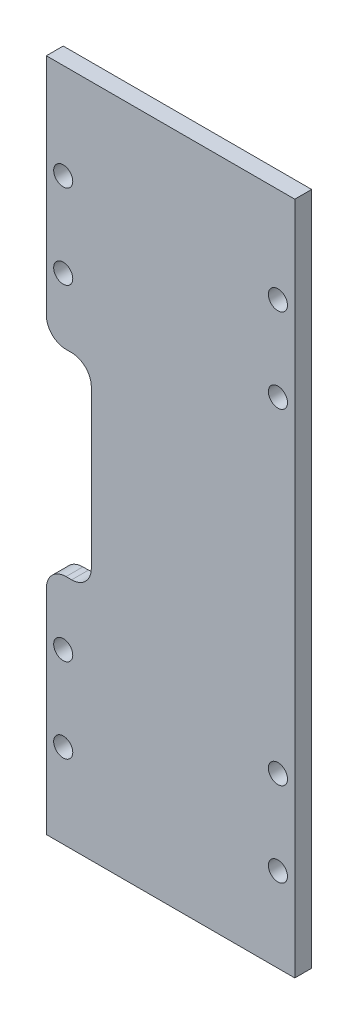
ISO-10303-21;
HEADER;
FILE_DESCRIPTION(('STEP AP214'),'2;1');
FILE_NAME('part.step','',(''),(''),'','','');
FILE_SCHEMA(('AUTOMOTIVE_DESIGN { 1 0 10303 214 1 1 1 1 }'));
ENDSEC;
DATA;
#1=APPLICATION_CONTEXT('core data for automotive mechanical design processes');
#2=APPLICATION_PROTOCOL_DEFINITION('international standard','automotive_design',2000,#1);
#3=PRODUCT_CONTEXT('',#1,'mechanical');
#4=PRODUCT('Part','Part','',(#3));
#5=PRODUCT_RELATED_PRODUCT_CATEGORY('part','',(#4));
#6=PRODUCT_DEFINITION_FORMATION('','',#4);
#7=PRODUCT_DEFINITION_CONTEXT('part definition',#1,'design');
#8=PRODUCT_DEFINITION('design','',#6,#7);
#9=PRODUCT_DEFINITION_SHAPE('','',#8);
#10=(LENGTH_UNIT() NAMED_UNIT(*) SI_UNIT(.MILLI.,.METRE.));
#11=(NAMED_UNIT(*) PLANE_ANGLE_UNIT() SI_UNIT($,.RADIAN.));
#12=(NAMED_UNIT(*) SI_UNIT($,.STERADIAN.) SOLID_ANGLE_UNIT());
#13=UNCERTAINTY_MEASURE_WITH_UNIT(LENGTH_MEASURE(1.E-05),#10,'distance_accuracy_value','');
#14=(GEOMETRIC_REPRESENTATION_CONTEXT(3) GLOBAL_UNCERTAINTY_ASSIGNED_CONTEXT((#13)) GLOBAL_UNIT_ASSIGNED_CONTEXT((#10,
#11,#12)) REPRESENTATION_CONTEXT('',''));
#15=CARTESIAN_POINT('',(0.,0.,0.));
#16=DIRECTION('',(0.,0.,1.));
#17=DIRECTION('',(1.,0.,0.));
#18=AXIS2_PLACEMENT_3D('',#15,#16,#17);
#19=CARTESIAN_POINT('',(-21.7876310709739,70.4697823685379,3.));
#20=DIRECTION('',(1.,0.,0.));
#21=DIRECTION('',(0.,0.,-1.));
#22=AXIS2_PLACEMENT_3D('',#19,#20,#21);
#23=PLANE('',#22);
#24=DIRECTION('',(0.,-1.,0.));
#25=VECTOR('',#24,1.);
#26=CARTESIAN_POINT('',(-21.7876310709739,70.4697823685379,0.));
#27=LINE('',#26,#25);
#28=CARTESIAN_POINT('',(-21.7876310709739,70.4697823685379,0.));
#29=VERTEX_POINT('',#28);
#30=CARTESIAN_POINT('',(-21.7876310709739,30.4697823685379,0.));
#31=VERTEX_POINT('',#30);
#32=EDGE_CURVE('E332',#29,#31,#27,.T.);
#33=ORIENTED_EDGE('',*,*,#32,.T.);
#34=DIRECTION('',(0.,0.,1.));
#35=VECTOR('',#34,1.);
#36=CARTESIAN_POINT('',(-21.7876310709739,30.4697823685379,3.));
#37=LINE('',#36,#35);
#38=CARTESIAN_POINT('',(-21.7876310709739,30.4697823685379,3.));
#39=VERTEX_POINT('',#38);
#40=EDGE_CURVE('E243',#31,#39,#37,.T.);
#41=ORIENTED_EDGE('',*,*,#40,.T.);
#42=DIRECTION('',(0.,-1.,0.));
#43=VECTOR('',#42,1.);
#44=CARTESIAN_POINT('',(-21.7876310709739,70.4697823685379,3.));
#45=LINE('',#44,#43);
#46=CARTESIAN_POINT('',(-21.7876310709739,70.4697823685379,3.));
#47=VERTEX_POINT('',#46);
#48=EDGE_CURVE('E160',#47,#39,#45,.T.);
#49=ORIENTED_EDGE('',*,*,#48,.F.);
#50=DIRECTION('',(0.,0.,-1.));
#51=VECTOR('',#50,1.);
#52=CARTESIAN_POINT('',(-21.7876310709739,70.4697823685379,3.));
#53=LINE('',#52,#51);
#54=EDGE_CURVE('E331',#47,#29,#53,.T.);
#55=ORIENTED_EDGE('',*,*,#54,.T.);
#56=EDGE_LOOP('',(#33,#41,#49,#55));
#57=FACE_BOUND('',#56,.T.);
#58=ADVANCED_FACE('F49',(#57),#23,.F.);
#59=CARTESIAN_POINT('',(-21.7876310709739,-11.5302176314621,3.));
#60=VERTEX_POINT('',#59);
#61=CARTESIAN_POINT('',(-21.7876310709739,-49.5302176314621,3.));
#62=VERTEX_POINT('',#61);
#63=EDGE_CURVE('E148',#60,#62,#45,.T.);
#64=ORIENTED_EDGE('',*,*,#63,.F.);
#65=DIRECTION('',(0.,0.,1.));
#66=VECTOR('',#65,1.);
#67=CARTESIAN_POINT('',(-21.7876310709739,-11.5302176314621,3.));
#68=LINE('',#67,#66);
#69=CARTESIAN_POINT('',(-21.7876310709739,-11.5302176314621,0.));
#70=VERTEX_POINT('',#69);
#71=EDGE_CURVE('E228',#60,#70,#68,.F.);
#72=ORIENTED_EDGE('',*,*,#71,.T.);
#73=CARTESIAN_POINT('',(-21.7876310709739,-49.5302176314621,0.));
#74=VERTEX_POINT('',#73);
#75=EDGE_CURVE('E175',#70,#74,#27,.T.);
#76=ORIENTED_EDGE('',*,*,#75,.T.);
#77=DIRECTION('',(0.,0.,-1.));
#78=VECTOR('',#77,1.);
#79=CARTESIAN_POINT('',(-21.7876310709739,-49.5302176314621,3.));
#80=LINE('',#79,#78);
#81=EDGE_CURVE('E166',#62,#74,#80,.T.);
#82=ORIENTED_EDGE('',*,*,#81,.F.);
#83=EDGE_LOOP('',(#64,#72,#76,#82));
#84=FACE_BOUND('',#83,.T.);
#85=ADVANCED_FACE('F173',(#84),#23,.F.);
#86=CARTESIAN_POINT('',(-21.7876310709739,-49.5302176314621,3.));
#87=DIRECTION('',(0.,1.,0.));
#88=DIRECTION('',(0.,0.,1.));
#89=AXIS2_PLACEMENT_3D('',#86,#87,#88);
#90=PLANE('',#89);
#91=DIRECTION('',(1.,0.,0.));
#92=VECTOR('',#91,1.);
#93=CARTESIAN_POINT('',(-21.7876310709739,-49.5302176314621,0.));
#94=LINE('',#93,#92);
#95=CARTESIAN_POINT('',(22.4123689290261,-49.5302176314621,0.));
#96=VERTEX_POINT('',#95);
#97=EDGE_CURVE('E335',#74,#96,#94,.T.);
#98=ORIENTED_EDGE('',*,*,#97,.T.);
#99=DIRECTION('',(0.,0.,-1.));
#100=VECTOR('',#99,1.);
#101=CARTESIAN_POINT('',(22.4123689290261,-49.5302176314621,3.));
#102=LINE('',#101,#100);
#103=CARTESIAN_POINT('',(22.4123689290261,-49.5302176314621,3.));
#104=VERTEX_POINT('',#103);
#105=EDGE_CURVE('E168',#104,#96,#102,.T.);
#106=ORIENTED_EDGE('',*,*,#105,.F.);
#107=DIRECTION('',(1.,0.,0.));
#108=VECTOR('',#107,1.);
#109=CARTESIAN_POINT('',(-21.7876310709739,-49.5302176314621,3.));
#110=LINE('',#109,#108);
#111=EDGE_CURVE('E153',#62,#104,#110,.T.);
#112=ORIENTED_EDGE('',*,*,#111,.F.);
#113=ORIENTED_EDGE('',*,*,#81,.T.);
#114=EDGE_LOOP('',(#98,#106,#112,#113));
#115=FACE_BOUND('',#114,.T.);
#116=ADVANCED_FACE('F165',(#115),#90,.F.);
#117=CARTESIAN_POINT('',(22.4123689290261,70.4697823685379,3.));
#118=DIRECTION('',(-1.,0.,0.));
#119=DIRECTION('',(0.,0.,1.));
#120=AXIS2_PLACEMENT_3D('',#117,#118,#119);
#121=PLANE('',#120);
#122=DIRECTION('',(0.,1.,0.));
#123=VECTOR('',#122,1.);
#124=CARTESIAN_POINT('',(22.4123689290261,70.4697823685379,0.));
#125=LINE('',#124,#123);
#126=CARTESIAN_POINT('',(22.4123689290261,70.4697823685379,0.));
#127=VERTEX_POINT('',#126);
#128=EDGE_CURVE('E338',#96,#127,#125,.T.);
#129=ORIENTED_EDGE('',*,*,#128,.T.);
#130=DIRECTION('',(0.,0.,-1.));
#131=VECTOR('',#130,1.);
#132=CARTESIAN_POINT('',(22.4123689290261,70.4697823685379,3.));
#133=LINE('',#132,#131);
#134=CARTESIAN_POINT('',(22.4123689290261,70.4697823685379,3.));
#135=VERTEX_POINT('',#134);
#136=EDGE_CURVE('E184',#135,#127,#133,.T.);
#137=ORIENTED_EDGE('',*,*,#136,.F.);
#138=DIRECTION('',(0.,1.,0.));
#139=VECTOR('',#138,1.);
#140=CARTESIAN_POINT('',(22.4123689290261,70.4697823685379,3.));
#141=LINE('',#140,#139);
#142=EDGE_CURVE('E171',#104,#135,#141,.T.);
#143=ORIENTED_EDGE('',*,*,#142,.F.);
#144=ORIENTED_EDGE('',*,*,#105,.T.);
#145=EDGE_LOOP('',(#129,#137,#143,#144));
#146=FACE_BOUND('',#145,.T.);
#147=ADVANCED_FACE('F360',(#146),#121,.F.);
#148=CARTESIAN_POINT('',(-21.7876310709739,70.4697823685379,3.));
#149=DIRECTION('',(0.,-1.,0.));
#150=DIRECTION('',(0.,0.,-1.));
#151=AXIS2_PLACEMENT_3D('',#148,#149,#150);
#152=PLANE('',#151);
#153=DIRECTION('',(-1.,0.,0.));
#154=VECTOR('',#153,1.);
#155=CARTESIAN_POINT('',(-21.7876310709739,70.4697823685379,0.));
#156=LINE('',#155,#154);
#157=EDGE_CURVE('E161',#127,#29,#156,.T.);
#158=ORIENTED_EDGE('',*,*,#157,.T.);
#159=ORIENTED_EDGE('',*,*,#54,.F.);
#160=DIRECTION('',(-1.,0.,0.));
#161=VECTOR('',#160,1.);
#162=CARTESIAN_POINT('',(-21.7876310709739,70.4697823685379,3.));
#163=LINE('',#162,#161);
#164=EDGE_CURVE('E328',#135,#47,#163,.T.);
#165=ORIENTED_EDGE('',*,*,#164,.F.);
#166=ORIENTED_EDGE('',*,*,#136,.T.);
#167=EDGE_LOOP('',(#158,#159,#165,#166));
#168=FACE_BOUND('',#167,.T.);
#169=ADVANCED_FACE('F351',(#168),#152,.F.);
#170=CARTESIAN_POINT('',(0.,0.,3.));
#171=DIRECTION('',(0.,0.,1.));
#172=DIRECTION('',(1.,0.,0.));
#173=AXIS2_PLACEMENT_3D('',#170,#171,#172);
#174=PLANE('',#173);
#175=DIRECTION('',(1.,0.,0.));
#176=VECTOR('',#175,1.);
#177=CARTESIAN_POINT('',(-21.7876310709739,-8.03021763146214,3.));
#178=LINE('',#177,#176);
#179=CARTESIAN_POINT('',(-18.2876310709739,-8.03021763146214,3.));
#180=VERTEX_POINT('',#179);
#181=CARTESIAN_POINT('',(-17.2876310709739,-8.03021763146214,3.));
#182=VERTEX_POINT('',#181);
#183=EDGE_CURVE('E273',#180,#182,#178,.T.);
#184=ORIENTED_EDGE('',*,*,#183,.F.);
#185=CARTESIAN_POINT('',(-18.2876310709739,-11.5302176314621,3.));
#186=DIRECTION('',(0.,0.,1.));
#187=DIRECTION('',(1.,0.,0.));
#188=AXIS2_PLACEMENT_3D('',#185,#186,#187);
#189=CIRCLE('',#188,3.5);
#190=EDGE_CURVE('E155',#180,#60,#189,.T.);
#191=ORIENTED_EDGE('',*,*,#190,.T.);
#192=ORIENTED_EDGE('',*,*,#63,.T.);
#193=ORIENTED_EDGE('',*,*,#111,.T.);
#194=ORIENTED_EDGE('',*,*,#142,.T.);
#195=ORIENTED_EDGE('',*,*,#164,.T.);
#196=ORIENTED_EDGE('',*,*,#48,.T.);
#197=CARTESIAN_POINT('',(-18.2876310709739,30.4697823685379,3.));
#198=DIRECTION('',(0.,0.,1.));
#199=DIRECTION('',(1.,0.,0.));
#200=AXIS2_PLACEMENT_3D('',#197,#198,#199);
#201=CIRCLE('',#200,3.5);
#202=CARTESIAN_POINT('',(-18.2876310709739,26.9697823685379,3.));
#203=VERTEX_POINT('',#202);
#204=EDGE_CURVE('E223',#39,#203,#201,.T.);
#205=ORIENTED_EDGE('',*,*,#204,.T.);
#206=DIRECTION('',(-1.,0.,0.));
#207=VECTOR('',#206,1.);
#208=CARTESIAN_POINT('',(-21.7876310709739,26.9697823685379,3.));
#209=LINE('',#208,#207);
#210=CARTESIAN_POINT('',(-17.2876310709739,26.9697823685379,3.));
#211=VERTEX_POINT('',#210);
#212=EDGE_CURVE('E263',#211,#203,#209,.T.);
#213=ORIENTED_EDGE('',*,*,#212,.F.);
#214=CARTESIAN_POINT('',(-17.2876310709739,23.4697823685379,3.));
#215=DIRECTION('',(0.,0.,1.));
#216=DIRECTION('',(1.,0.,0.));
#217=AXIS2_PLACEMENT_3D('',#214,#215,#216);
#218=CIRCLE('',#217,3.5);
#219=CARTESIAN_POINT('',(-13.7876310709739,23.4697823685379,3.));
#220=VERTEX_POINT('',#219);
#221=EDGE_CURVE('E58',#211,#220,#218,.F.);
#222=ORIENTED_EDGE('',*,*,#221,.T.);
#223=DIRECTION('',(0.,1.,0.));
#224=VECTOR('',#223,1.);
#225=CARTESIAN_POINT('',(-13.7876310709739,26.9697823685379,3.));
#226=LINE('',#225,#224);
#227=CARTESIAN_POINT('',(-13.7876310709739,-4.53021763146214,3.));
#228=VERTEX_POINT('',#227);
#229=EDGE_CURVE('E262',#228,#220,#226,.T.);
#230=ORIENTED_EDGE('',*,*,#229,.F.);
#231=CARTESIAN_POINT('',(-17.2876310709739,-4.53021763146214,3.));
#232=DIRECTION('',(0.,0.,1.));
#233=DIRECTION('',(1.,0.,0.));
#234=AXIS2_PLACEMENT_3D('',#231,#232,#233);
#235=CIRCLE('',#234,3.5);
#236=EDGE_CURVE('E253',#228,#182,#235,.F.);
#237=ORIENTED_EDGE('',*,*,#236,.T.);
#238=EDGE_LOOP('',(#184,#191,#192,#193,#194,#195,#196,#205,#213,#222,#230,#237));
#239=FACE_BOUND('',#238,.T.);
#240=CARTESIAN_POINT('',(-18.7876310709739,53.4697823685378,3.));
#241=DIRECTION('',(0.,0.,1.));
#242=DIRECTION('',(1.,0.,0.));
#243=AXIS2_PLACEMENT_3D('',#240,#241,#242);
#244=CIRCLE('',#243,1.7);
#245=CARTESIAN_POINT('',(-17.0876310709739,53.4697823685378,3.));
#246=VERTEX_POINT('',#245);
#247=EDGE_CURVE('E218',#246,#246,#244,.T.);
#248=ORIENTED_EDGE('',*,*,#247,.F.);
#249=EDGE_LOOP('',(#248));
#250=FACE_BOUND('',#249,.T.);
#251=CARTESIAN_POINT('',(-18.7876310709739,38.4697823685378,3.));
#252=DIRECTION('',(0.,0.,1.));
#253=DIRECTION('',(1.,0.,0.));
#254=AXIS2_PLACEMENT_3D('',#251,#252,#253);
#255=CIRCLE('',#254,1.7);
#256=CARTESIAN_POINT('',(-17.0876310709739,38.4697823685378,3.));
#257=VERTEX_POINT('',#256);
#258=EDGE_CURVE('E214',#257,#257,#255,.T.);
#259=ORIENTED_EDGE('',*,*,#258,.F.);
#260=EDGE_LOOP('',(#259));
#261=FACE_BOUND('',#260,.T.);
#262=CARTESIAN_POINT('',(-18.7876310709739,-19.5302176314621,3.));
#263=DIRECTION('',(0.,0.,1.));
#264=DIRECTION('',(1.,0.,0.));
#265=AXIS2_PLACEMENT_3D('',#262,#263,#264);
#266=CIRCLE('',#265,1.7);
#267=CARTESIAN_POINT('',(-17.0876310709739,-19.5302176314621,3.));
#268=VERTEX_POINT('',#267);
#269=EDGE_CURVE('E209',#268,#268,#266,.T.);
#270=ORIENTED_EDGE('',*,*,#269,.F.);
#271=EDGE_LOOP('',(#270));
#272=FACE_BOUND('',#271,.T.);
#273=CARTESIAN_POINT('',(-18.7876310709739,-34.5302176314621,3.));
#274=DIRECTION('',(0.,0.,1.));
#275=DIRECTION('',(1.,0.,0.));
#276=AXIS2_PLACEMENT_3D('',#273,#274,#275);
#277=CIRCLE('',#276,1.7);
#278=CARTESIAN_POINT('',(-17.0876310709739,-34.5302176314621,3.));
#279=VERTEX_POINT('',#278);
#280=EDGE_CURVE('E208',#279,#279,#277,.T.);
#281=ORIENTED_EDGE('',*,*,#280,.F.);
#282=EDGE_LOOP('',(#281));
#283=FACE_BOUND('',#282,.T.);
#284=CARTESIAN_POINT('',(19.4123689290261,-34.5302176314621,3.));
#285=DIRECTION('',(0.,0.,1.));
#286=DIRECTION('',(1.,0.,0.));
#287=AXIS2_PLACEMENT_3D('',#284,#285,#286);
#288=CIRCLE('',#287,1.7);
#289=CARTESIAN_POINT('',(21.1123689290261,-34.5302176314621,3.));
#290=VERTEX_POINT('',#289);
#291=EDGE_CURVE('E203',#290,#290,#288,.T.);
#292=ORIENTED_EDGE('',*,*,#291,.F.);
#293=EDGE_LOOP('',(#292));
#294=FACE_BOUND('',#293,.T.);
#295=CARTESIAN_POINT('',(19.4123689290261,-19.5302176314621,3.));
#296=DIRECTION('',(0.,0.,1.));
#297=DIRECTION('',(1.,0.,0.));
#298=AXIS2_PLACEMENT_3D('',#295,#296,#297);
#299=CIRCLE('',#298,1.7);
#300=CARTESIAN_POINT('',(21.1123689290261,-19.5302176314621,3.));
#301=VERTEX_POINT('',#300);
#302=EDGE_CURVE('E198',#301,#301,#299,.T.);
#303=ORIENTED_EDGE('',*,*,#302,.F.);
#304=EDGE_LOOP('',(#303));
#305=FACE_BOUND('',#304,.T.);
#306=CARTESIAN_POINT('',(19.4123689290261,38.4697823685378,3.));
#307=DIRECTION('',(0.,0.,1.));
#308=DIRECTION('',(1.,0.,0.));
#309=AXIS2_PLACEMENT_3D('',#306,#307,#308);
#310=CIRCLE('',#309,1.7);
#311=CARTESIAN_POINT('',(21.1123689290261,38.4697823685378,3.));
#312=VERTEX_POINT('',#311);
#313=EDGE_CURVE('E193',#312,#312,#310,.T.);
#314=ORIENTED_EDGE('',*,*,#313,.F.);
#315=EDGE_LOOP('',(#314));
#316=FACE_BOUND('',#315,.T.);
#317=CARTESIAN_POINT('',(19.4123689290261,53.4697823685378,3.));
#318=DIRECTION('',(0.,0.,1.));
#319=DIRECTION('',(1.,0.,0.));
#320=AXIS2_PLACEMENT_3D('',#317,#318,#319);
#321=CIRCLE('',#320,1.7);
#322=CARTESIAN_POINT('',(21.1123689290261,53.4697823685378,3.));
#323=VERTEX_POINT('',#322);
#324=EDGE_CURVE('E192',#323,#323,#321,.T.);
#325=ORIENTED_EDGE('',*,*,#324,.F.);
#326=EDGE_LOOP('',(#325));
#327=FACE_BOUND('',#326,.T.);
#328=ADVANCED_FACE('F151',(#239,#250,#261,#272,#283,#294,#305,#316,#327),#174,.T.);
#329=CARTESIAN_POINT('',(0.,0.,0.));
#330=DIRECTION('',(0.,0.,1.));
#331=DIRECTION('',(1.,0.,0.));
#332=AXIS2_PLACEMENT_3D('',#329,#330,#331);
#333=PLANE('',#332);
#334=CARTESIAN_POINT('',(-18.7876310709739,53.4697823685378,0.));
#335=DIRECTION('',(0.,0.,1.));
#336=DIRECTION('',(1.,0.,0.));
#337=AXIS2_PLACEMENT_3D('',#334,#335,#336);
#338=CIRCLE('',#337,1.7);
#339=CARTESIAN_POINT('',(-17.0876310709739,53.4697823685378,0.));
#340=VERTEX_POINT('',#339);
#341=EDGE_CURVE('E215',#340,#340,#338,.T.);
#342=ORIENTED_EDGE('',*,*,#341,.T.);
#343=EDGE_LOOP('',(#342));
#344=FACE_BOUND('',#343,.T.);
#345=CARTESIAN_POINT('',(-18.7876310709739,38.4697823685378,0.));
#346=DIRECTION('',(0.,0.,1.));
#347=DIRECTION('',(1.,0.,0.));
#348=AXIS2_PLACEMENT_3D('',#345,#346,#347);
#349=CIRCLE('',#348,1.7);
#350=CARTESIAN_POINT('',(-17.0876310709739,38.4697823685378,0.));
#351=VERTEX_POINT('',#350);
#352=EDGE_CURVE('E210',#351,#351,#349,.T.);
#353=ORIENTED_EDGE('',*,*,#352,.T.);
#354=EDGE_LOOP('',(#353));
#355=FACE_BOUND('',#354,.T.);
#356=CARTESIAN_POINT('',(-18.7876310709739,-19.5302176314621,0.));
#357=DIRECTION('',(0.,0.,1.));
#358=DIRECTION('',(1.,0.,0.));
#359=AXIS2_PLACEMENT_3D('',#356,#357,#358);
#360=CIRCLE('',#359,1.7);
#361=CARTESIAN_POINT('',(-17.0876310709739,-19.5302176314621,0.));
#362=VERTEX_POINT('',#361);
#363=EDGE_CURVE('E204',#362,#362,#360,.T.);
#364=ORIENTED_EDGE('',*,*,#363,.T.);
#365=EDGE_LOOP('',(#364));
#366=FACE_BOUND('',#365,.T.);
#367=CARTESIAN_POINT('',(-18.7876310709739,-34.5302176314621,0.));
#368=DIRECTION('',(0.,0.,1.));
#369=DIRECTION('',(1.,0.,0.));
#370=AXIS2_PLACEMENT_3D('',#367,#368,#369);
#371=CIRCLE('',#370,1.7);
#372=CARTESIAN_POINT('',(-17.0876310709739,-34.5302176314621,0.));
#373=VERTEX_POINT('',#372);
#374=EDGE_CURVE('E304',#373,#373,#371,.T.);
#375=ORIENTED_EDGE('',*,*,#374,.T.);
#376=EDGE_LOOP('',(#375));
#377=FACE_BOUND('',#376,.T.);
#378=CARTESIAN_POINT('',(19.4123689290261,-34.5302176314621,0.));
#379=DIRECTION('',(0.,0.,1.));
#380=DIRECTION('',(1.,0.,0.));
#381=AXIS2_PLACEMENT_3D('',#378,#379,#380);
#382=CIRCLE('',#381,1.7);
#383=CARTESIAN_POINT('',(21.1123689290261,-34.5302176314621,0.));
#384=VERTEX_POINT('',#383);
#385=EDGE_CURVE('E199',#384,#384,#382,.T.);
#386=ORIENTED_EDGE('',*,*,#385,.T.);
#387=EDGE_LOOP('',(#386));
#388=FACE_BOUND('',#387,.T.);
#389=CARTESIAN_POINT('',(19.4123689290261,-19.5302176314621,0.));
#390=DIRECTION('',(0.,0.,1.));
#391=DIRECTION('',(1.,0.,0.));
#392=AXIS2_PLACEMENT_3D('',#389,#390,#391);
#393=CIRCLE('',#392,1.7);
#394=CARTESIAN_POINT('',(21.1123689290261,-19.5302176314621,0.));
#395=VERTEX_POINT('',#394);
#396=EDGE_CURVE('E194',#395,#395,#393,.T.);
#397=ORIENTED_EDGE('',*,*,#396,.T.);
#398=EDGE_LOOP('',(#397));
#399=FACE_BOUND('',#398,.T.);
#400=CARTESIAN_POINT('',(19.4123689290261,38.4697823685378,0.));
#401=DIRECTION('',(0.,0.,1.));
#402=DIRECTION('',(1.,0.,0.));
#403=AXIS2_PLACEMENT_3D('',#400,#401,#402);
#404=CIRCLE('',#403,1.7);
#405=CARTESIAN_POINT('',(21.1123689290261,38.4697823685378,0.));
#406=VERTEX_POINT('',#405);
#407=EDGE_CURVE('E188',#406,#406,#404,.T.);
#408=ORIENTED_EDGE('',*,*,#407,.T.);
#409=EDGE_LOOP('',(#408));
#410=FACE_BOUND('',#409,.T.);
#411=CARTESIAN_POINT('',(19.4123689290261,53.4697823685378,0.));
#412=DIRECTION('',(0.,0.,1.));
#413=DIRECTION('',(1.,0.,0.));
#414=AXIS2_PLACEMENT_3D('',#411,#412,#413);
#415=CIRCLE('',#414,1.7);
#416=CARTESIAN_POINT('',(21.1123689290261,53.4697823685378,0.));
#417=VERTEX_POINT('',#416);
#418=EDGE_CURVE('E320',#417,#417,#415,.T.);
#419=ORIENTED_EDGE('',*,*,#418,.T.);
#420=EDGE_LOOP('',(#419));
#421=FACE_BOUND('',#420,.T.);
#422=ORIENTED_EDGE('',*,*,#75,.F.);
#423=CARTESIAN_POINT('',(-18.2876310709739,-11.5302176314621,0.));
#424=DIRECTION('',(0.,0.,1.));
#425=DIRECTION('',(1.,0.,0.));
#426=AXIS2_PLACEMENT_3D('',#423,#424,#425);
#427=CIRCLE('',#426,3.5);
#428=CARTESIAN_POINT('',(-18.2876310709739,-8.03021763146214,0.));
#429=VERTEX_POINT('',#428);
#430=EDGE_CURVE('E233',#70,#429,#427,.F.);
#431=ORIENTED_EDGE('',*,*,#430,.T.);
#432=DIRECTION('',(1.,0.,0.));
#433=VECTOR('',#432,1.);
#434=CARTESIAN_POINT('',(-21.7876310709739,-8.03021763146214,0.));
#435=LINE('',#434,#433);
#436=CARTESIAN_POINT('',(-17.2876310709739,-8.03021763146214,0.));
#437=VERTEX_POINT('',#436);
#438=EDGE_CURVE('E286',#429,#437,#435,.T.);
#439=ORIENTED_EDGE('',*,*,#438,.T.);
#440=CARTESIAN_POINT('',(-17.2876310709739,-4.53021763146214,0.));
#441=DIRECTION('',(0.,0.,1.));
#442=DIRECTION('',(1.,0.,0.));
#443=AXIS2_PLACEMENT_3D('',#440,#441,#442);
#444=CIRCLE('',#443,3.5);
#445=CARTESIAN_POINT('',(-13.7876310709739,-4.53021763146214,0.));
#446=VERTEX_POINT('',#445);
#447=EDGE_CURVE('E256',#437,#446,#444,.T.);
#448=ORIENTED_EDGE('',*,*,#447,.T.);
#449=DIRECTION('',(0.,1.,0.));
#450=VECTOR('',#449,1.);
#451=CARTESIAN_POINT('',(-13.7876310709739,26.9697823685379,0.));
#452=LINE('',#451,#450);
#453=CARTESIAN_POINT('',(-13.7876310709739,23.4697823685379,0.));
#454=VERTEX_POINT('',#453);
#455=EDGE_CURVE('E278',#446,#454,#452,.T.);
#456=ORIENTED_EDGE('',*,*,#455,.T.);
#457=CARTESIAN_POINT('',(-17.2876310709739,23.4697823685379,0.));
#458=DIRECTION('',(0.,0.,1.));
#459=DIRECTION('',(1.,0.,0.));
#460=AXIS2_PLACEMENT_3D('',#457,#458,#459);
#461=CIRCLE('',#460,3.5);
#462=CARTESIAN_POINT('',(-17.2876310709739,26.9697823685379,0.));
#463=VERTEX_POINT('',#462);
#464=EDGE_CURVE('E11',#454,#463,#461,.T.);
#465=ORIENTED_EDGE('',*,*,#464,.T.);
#466=DIRECTION('',(-1.,0.,0.));
#467=VECTOR('',#466,1.);
#468=CARTESIAN_POINT('',(-21.7876310709739,26.9697823685379,0.));
#469=LINE('',#468,#467);
#470=CARTESIAN_POINT('',(-18.2876310709739,26.9697823685379,0.));
#471=VERTEX_POINT('',#470);
#472=EDGE_CURVE('E277',#463,#471,#469,.T.);
#473=ORIENTED_EDGE('',*,*,#472,.T.);
#474=CARTESIAN_POINT('',(-18.2876310709739,30.4697823685379,0.));
#475=DIRECTION('',(0.,0.,1.));
#476=DIRECTION('',(1.,0.,0.));
#477=AXIS2_PLACEMENT_3D('',#474,#475,#476);
#478=CIRCLE('',#477,3.5);
#479=EDGE_CURVE('E68',#471,#31,#478,.F.);
#480=ORIENTED_EDGE('',*,*,#479,.T.);
#481=ORIENTED_EDGE('',*,*,#32,.F.);
#482=ORIENTED_EDGE('',*,*,#157,.F.);
#483=ORIENTED_EDGE('',*,*,#128,.F.);
#484=ORIENTED_EDGE('',*,*,#97,.F.);
#485=EDGE_LOOP('',(#422,#431,#439,#448,#456,#465,#473,#480,#481,#482,#483,#484));
#486=FACE_BOUND('',#485,.T.);
#487=ADVANCED_FACE('F276',(#344,#355,#366,#377,#388,#399,#410,#421,#486),#333,.F.);
#488=CARTESIAN_POINT('',(19.4123689290261,53.4697823685378,3.));
#489=DIRECTION('',(0.,0.,1.));
#490=DIRECTION('',(1.,0.,0.));
#491=AXIS2_PLACEMENT_3D('',#488,#489,#490);
#492=CYLINDRICAL_SURFACE('',#491,1.7);
#493=ORIENTED_EDGE('',*,*,#324,.T.);
#494=EDGE_LOOP('',(#493));
#495=FACE_BOUND('',#494,.T.);
#496=ORIENTED_EDGE('',*,*,#418,.F.);
#497=EDGE_LOOP('',(#496));
#498=FACE_BOUND('',#497,.T.);
#499=ADVANCED_FACE('F506',(#495,#498),#492,.F.);
#500=CARTESIAN_POINT('',(19.4123689290261,38.4697823685378,3.));
#501=DIRECTION('',(0.,0.,1.));
#502=DIRECTION('',(1.,0.,0.));
#503=AXIS2_PLACEMENT_3D('',#500,#501,#502);
#504=CYLINDRICAL_SURFACE('',#503,1.7);
#505=ORIENTED_EDGE('',*,*,#313,.T.);
#506=EDGE_LOOP('',(#505));
#507=FACE_BOUND('',#506,.T.);
#508=ORIENTED_EDGE('',*,*,#407,.F.);
#509=EDGE_LOOP('',(#508));
#510=FACE_BOUND('',#509,.T.);
#511=ADVANCED_FACE('F496',(#507,#510),#504,.F.);
#512=CARTESIAN_POINT('',(19.4123689290261,-19.5302176314621,3.));
#513=DIRECTION('',(0.,0.,1.));
#514=DIRECTION('',(1.,0.,0.));
#515=AXIS2_PLACEMENT_3D('',#512,#513,#514);
#516=CYLINDRICAL_SURFACE('',#515,1.7);
#517=ORIENTED_EDGE('',*,*,#302,.T.);
#518=EDGE_LOOP('',(#517));
#519=FACE_BOUND('',#518,.T.);
#520=ORIENTED_EDGE('',*,*,#396,.F.);
#521=EDGE_LOOP('',(#520));
#522=FACE_BOUND('',#521,.T.);
#523=ADVANCED_FACE('F486',(#519,#522),#516,.F.);
#524=CARTESIAN_POINT('',(19.4123689290261,-34.5302176314621,3.));
#525=DIRECTION('',(0.,0.,1.));
#526=DIRECTION('',(1.,0.,0.));
#527=AXIS2_PLACEMENT_3D('',#524,#525,#526);
#528=CYLINDRICAL_SURFACE('',#527,1.7);
#529=ORIENTED_EDGE('',*,*,#291,.T.);
#530=EDGE_LOOP('',(#529));
#531=FACE_BOUND('',#530,.T.);
#532=ORIENTED_EDGE('',*,*,#385,.F.);
#533=EDGE_LOOP('',(#532));
#534=FACE_BOUND('',#533,.T.);
#535=ADVANCED_FACE('F476',(#531,#534),#528,.F.);
#536=CARTESIAN_POINT('',(-18.7876310709739,-34.5302176314621,3.));
#537=DIRECTION('',(0.,0.,1.));
#538=DIRECTION('',(1.,0.,0.));
#539=AXIS2_PLACEMENT_3D('',#536,#537,#538);
#540=CYLINDRICAL_SURFACE('',#539,1.7);
#541=ORIENTED_EDGE('',*,*,#280,.T.);
#542=EDGE_LOOP('',(#541));
#543=FACE_BOUND('',#542,.T.);
#544=ORIENTED_EDGE('',*,*,#374,.F.);
#545=EDGE_LOOP('',(#544));
#546=FACE_BOUND('',#545,.T.);
#547=ADVANCED_FACE('F466',(#543,#546),#540,.F.);
#548=CARTESIAN_POINT('',(-18.7876310709739,-19.5302176314621,3.));
#549=DIRECTION('',(0.,0.,1.));
#550=DIRECTION('',(1.,0.,0.));
#551=AXIS2_PLACEMENT_3D('',#548,#549,#550);
#552=CYLINDRICAL_SURFACE('',#551,1.7);
#553=ORIENTED_EDGE('',*,*,#269,.T.);
#554=EDGE_LOOP('',(#553));
#555=FACE_BOUND('',#554,.T.);
#556=ORIENTED_EDGE('',*,*,#363,.F.);
#557=EDGE_LOOP('',(#556));
#558=FACE_BOUND('',#557,.T.);
#559=ADVANCED_FACE('F456',(#555,#558),#552,.F.);
#560=CARTESIAN_POINT('',(-18.7876310709739,38.4697823685378,3.));
#561=DIRECTION('',(0.,0.,1.));
#562=DIRECTION('',(1.,0.,0.));
#563=AXIS2_PLACEMENT_3D('',#560,#561,#562);
#564=CYLINDRICAL_SURFACE('',#563,1.7);
#565=ORIENTED_EDGE('',*,*,#258,.T.);
#566=EDGE_LOOP('',(#565));
#567=FACE_BOUND('',#566,.T.);
#568=ORIENTED_EDGE('',*,*,#352,.F.);
#569=EDGE_LOOP('',(#568));
#570=FACE_BOUND('',#569,.T.);
#571=ADVANCED_FACE('F446',(#567,#570),#564,.F.);
#572=CARTESIAN_POINT('',(-18.7876310709739,53.4697823685378,3.));
#573=DIRECTION('',(0.,0.,1.));
#574=DIRECTION('',(1.,0.,0.));
#575=AXIS2_PLACEMENT_3D('',#572,#573,#574);
#576=CYLINDRICAL_SURFACE('',#575,1.7);
#577=ORIENTED_EDGE('',*,*,#247,.T.);
#578=EDGE_LOOP('',(#577));
#579=FACE_BOUND('',#578,.T.);
#580=ORIENTED_EDGE('',*,*,#341,.F.);
#581=EDGE_LOOP('',(#580));
#582=FACE_BOUND('',#581,.T.);
#583=ADVANCED_FACE('F433',(#579,#582),#576,.F.);
#584=CARTESIAN_POINT('',(-21.7876310709739,26.9697823685379,0.));
#585=DIRECTION('',(0.,1.,0.));
#586=DIRECTION('',(-1.,0.,0.));
#587=AXIS2_PLACEMENT_3D('',#584,#585,#586);
#588=PLANE('',#587);
#589=ORIENTED_EDGE('',*,*,#212,.T.);
#590=DIRECTION('',(0.,0.,1.));
#591=VECTOR('',#590,1.);
#592=CARTESIAN_POINT('',(-18.2876310709739,26.9697823685379,0.));
#593=LINE('',#592,#591);
#594=EDGE_CURVE('E77',#203,#471,#593,.F.);
#595=ORIENTED_EDGE('',*,*,#594,.T.);
#596=ORIENTED_EDGE('',*,*,#472,.F.);
#597=DIRECTION('',(0.,0.,1.));
#598=VECTOR('',#597,1.);
#599=CARTESIAN_POINT('',(-17.2876310709739,26.9697823685379,3.));
#600=LINE('',#599,#598);
#601=EDGE_CURVE('E247',#463,#211,#600,.T.);
#602=ORIENTED_EDGE('',*,*,#601,.T.);
#603=EDGE_LOOP('',(#589,#595,#596,#602));
#604=FACE_BOUND('',#603,.T.);
#605=ADVANCED_FACE('F279',(#604),#588,.F.);
#606=CARTESIAN_POINT('',(-13.7876310709739,26.9697823685379,0.));
#607=DIRECTION('',(1.,0.,0.));
#608=DIRECTION('',(0.,1.,0.));
#609=AXIS2_PLACEMENT_3D('',#606,#607,#608);
#610=PLANE('',#609);
#611=ORIENTED_EDGE('',*,*,#455,.F.);
#612=DIRECTION('',(0.,0.,1.));
#613=VECTOR('',#612,1.);
#614=CARTESIAN_POINT('',(-13.7876310709739,-4.53021763146214,3.));
#615=LINE('',#614,#613);
#616=EDGE_CURVE('E239',#446,#228,#615,.T.);
#617=ORIENTED_EDGE('',*,*,#616,.T.);
#618=ORIENTED_EDGE('',*,*,#229,.T.);
#619=DIRECTION('',(0.,0.,1.));
#620=VECTOR('',#619,1.);
#621=CARTESIAN_POINT('',(-13.7876310709739,23.4697823685379,0.));
#622=LINE('',#621,#620);
#623=EDGE_CURVE('E236',#220,#454,#622,.F.);
#624=ORIENTED_EDGE('',*,*,#623,.T.);
#625=EDGE_LOOP('',(#611,#617,#618,#624));
#626=FACE_BOUND('',#625,.T.);
#627=ADVANCED_FACE('F269',(#626),#610,.F.);
#628=CARTESIAN_POINT('',(-21.7876310709739,-8.03021763146214,0.));
#629=DIRECTION('',(0.,-1.,0.));
#630=DIRECTION('',(1.,0.,0.));
#631=AXIS2_PLACEMENT_3D('',#628,#629,#630);
#632=PLANE('',#631);
#633=ORIENTED_EDGE('',*,*,#438,.F.);
#634=DIRECTION('',(0.,0.,1.));
#635=VECTOR('',#634,1.);
#636=CARTESIAN_POINT('',(-18.2876310709739,-8.03021763146214,0.));
#637=LINE('',#636,#635);
#638=EDGE_CURVE('E182',#429,#180,#637,.T.);
#639=ORIENTED_EDGE('',*,*,#638,.T.);
#640=ORIENTED_EDGE('',*,*,#183,.T.);
#641=DIRECTION('',(0.,0.,1.));
#642=VECTOR('',#641,1.);
#643=CARTESIAN_POINT('',(-17.2876310709739,-8.03021763146214,0.));
#644=LINE('',#643,#642);
#645=EDGE_CURVE('E178',#182,#437,#644,.F.);
#646=ORIENTED_EDGE('',*,*,#645,.T.);
#647=EDGE_LOOP('',(#633,#639,#640,#646));
#648=FACE_BOUND('',#647,.T.);
#649=ADVANCED_FACE('F380',(#648),#632,.F.);
#650=CARTESIAN_POINT('',(-18.2876310709739,-11.5302176314621,0.));
#651=DIRECTION('',(0.,0.,1.));
#652=DIRECTION('',(1.,0.,0.));
#653=AXIS2_PLACEMENT_3D('',#650,#651,#652);
#654=CYLINDRICAL_SURFACE('',#653,3.5);
#655=ORIENTED_EDGE('',*,*,#430,.F.);
#656=ORIENTED_EDGE('',*,*,#71,.F.);
#657=ORIENTED_EDGE('',*,*,#190,.F.);
#658=ORIENTED_EDGE('',*,*,#638,.F.);
#659=EDGE_LOOP('',(#655,#656,#657,#658));
#660=FACE_BOUND('',#659,.T.);
#661=ADVANCED_FACE('F376',(#660),#654,.T.);
#662=CARTESIAN_POINT('',(-17.2876310709739,-4.53021763146214,0.));
#663=DIRECTION('',(0.,0.,-1.));
#664=DIRECTION('',(-1.,0.,0.));
#665=AXIS2_PLACEMENT_3D('',#662,#663,#664);
#666=CYLINDRICAL_SURFACE('',#665,3.5);
#667=ORIENTED_EDGE('',*,*,#447,.F.);
#668=ORIENTED_EDGE('',*,*,#645,.F.);
#669=ORIENTED_EDGE('',*,*,#236,.F.);
#670=ORIENTED_EDGE('',*,*,#616,.F.);
#671=EDGE_LOOP('',(#667,#668,#669,#670));
#672=FACE_BOUND('',#671,.T.);
#673=ADVANCED_FACE('F379',(#672),#666,.F.);
#674=CARTESIAN_POINT('',(-18.2876310709739,30.4697823685379,3.));
#675=DIRECTION('',(0.,0.,1.));
#676=DIRECTION('',(1.,0.,0.));
#677=AXIS2_PLACEMENT_3D('',#674,#675,#676);
#678=CYLINDRICAL_SURFACE('',#677,3.5);
#679=ORIENTED_EDGE('',*,*,#479,.F.);
#680=ORIENTED_EDGE('',*,*,#594,.F.);
#681=ORIENTED_EDGE('',*,*,#204,.F.);
#682=ORIENTED_EDGE('',*,*,#40,.F.);
#683=EDGE_LOOP('',(#679,#680,#681,#682));
#684=FACE_BOUND('',#683,.T.);
#685=ADVANCED_FACE('F359',(#684),#678,.T.);
#686=CARTESIAN_POINT('',(-17.2876310709739,23.4697823685379,0.));
#687=DIRECTION('',(0.,0.,-1.));
#688=DIRECTION('',(-1.,0.,0.));
#689=AXIS2_PLACEMENT_3D('',#686,#687,#688);
#690=CYLINDRICAL_SURFACE('',#689,3.5);
#691=ORIENTED_EDGE('',*,*,#464,.F.);
#692=ORIENTED_EDGE('',*,*,#623,.F.);
#693=ORIENTED_EDGE('',*,*,#221,.F.);
#694=ORIENTED_EDGE('',*,*,#601,.F.);
#695=EDGE_LOOP('',(#691,#692,#693,#694));
#696=FACE_BOUND('',#695,.T.);
#697=ADVANCED_FACE('F51',(#696),#690,.F.);
#698=CLOSED_SHELL('',(#58,#85,#116,#147,#169,#328,#487,#499,#511,#523,#535,#547,#559,#571,#583,
#605,#627,#649,#661,#673,#685,#697));
#699=MANIFOLD_SOLID_BREP('B2',#698);
#700=ADVANCED_BREP_SHAPE_REPRESENTATION('',(#18,#699),#14);
#701=SHAPE_DEFINITION_REPRESENTATION(#9,#700);
ENDSEC;
END-ISO-10303-21;
